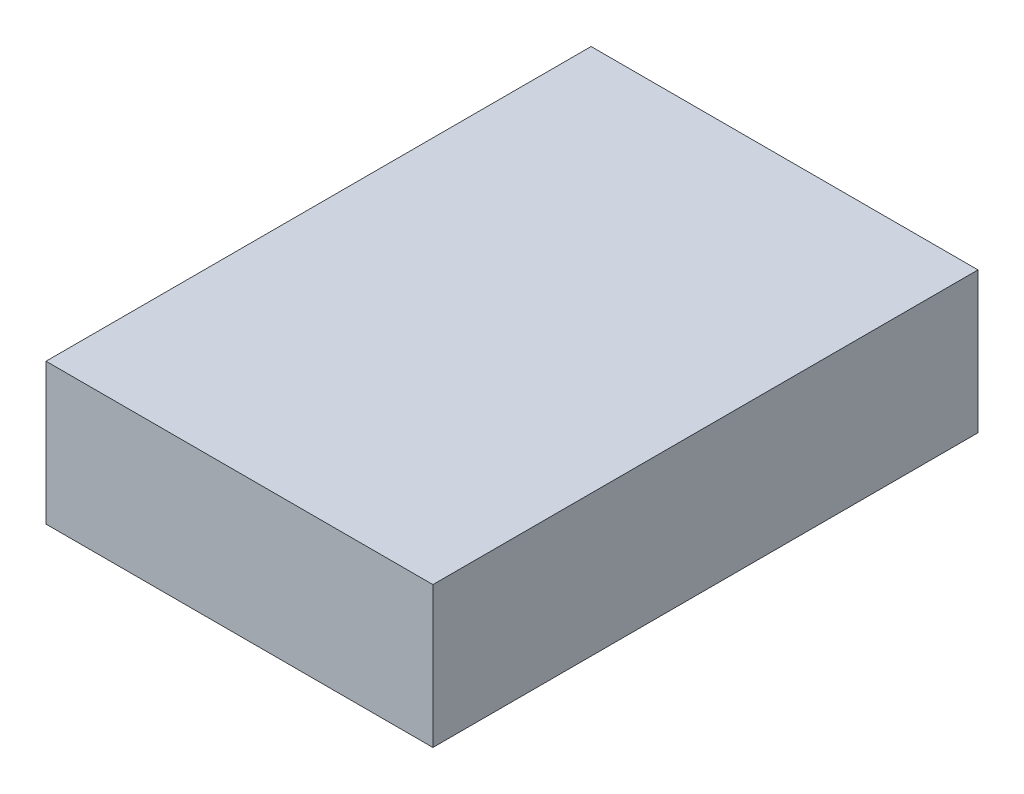
ISO-10303-21;
HEADER;
FILE_DESCRIPTION(('STEP AP214'),'2;1');
FILE_NAME('part.step','',(''),(''),'','','');
FILE_SCHEMA(('AUTOMOTIVE_DESIGN { 1 0 10303 214 1 1 1 1 }'));
ENDSEC;
DATA;
#1=APPLICATION_CONTEXT('core data for automotive mechanical design processes');
#2=APPLICATION_PROTOCOL_DEFINITION('international standard','automotive_design',2000,#1);
#3=PRODUCT_CONTEXT('',#1,'mechanical');
#4=PRODUCT('Part','Part','',(#3));
#5=PRODUCT_RELATED_PRODUCT_CATEGORY('part','',(#4));
#6=PRODUCT_DEFINITION_FORMATION('','',#4);
#7=PRODUCT_DEFINITION_CONTEXT('part definition',#1,'design');
#8=PRODUCT_DEFINITION('design','',#6,#7);
#9=PRODUCT_DEFINITION_SHAPE('','',#8);
#10=(LENGTH_UNIT() NAMED_UNIT(*) SI_UNIT(.MILLI.,.METRE.));
#11=(NAMED_UNIT(*) PLANE_ANGLE_UNIT() SI_UNIT($,.RADIAN.));
#12=(NAMED_UNIT(*) SI_UNIT($,.STERADIAN.) SOLID_ANGLE_UNIT());
#13=UNCERTAINTY_MEASURE_WITH_UNIT(LENGTH_MEASURE(1.E-05),#10,'distance_accuracy_value','');
#14=(GEOMETRIC_REPRESENTATION_CONTEXT(3) GLOBAL_UNCERTAINTY_ASSIGNED_CONTEXT((#13)) GLOBAL_UNIT_ASSIGNED_CONTEXT((#10,
#11,#12)) REPRESENTATION_CONTEXT('',''));
#15=CARTESIAN_POINT('',(0.,0.,0.));
#16=DIRECTION('',(0.,0.,1.));
#17=DIRECTION('',(1.,0.,0.));
#18=AXIS2_PLACEMENT_3D('',#15,#16,#17);
#19=CARTESIAN_POINT('',(0.,0.,64.77));
#20=DIRECTION('',(-1.,0.,0.));
#21=DIRECTION('',(0.,0.,1.));
#22=AXIS2_PLACEMENT_3D('',#19,#20,#21);
#23=PLANE('',#22);
#24=DIRECTION('',(0.,1.,0.));
#25=VECTOR('',#24,1.);
#26=CARTESIAN_POINT('',(0.,0.,0.));
#27=LINE('',#26,#25);
#28=CARTESIAN_POINT('',(0.,0.,0.));
#29=VERTEX_POINT('',#28);
#30=CARTESIAN_POINT('',(0.,16.764,0.));
#31=VERTEX_POINT('',#30);
#32=EDGE_CURVE('E99',#29,#31,#27,.T.);
#33=ORIENTED_EDGE('',*,*,#32,.F.);
#34=DIRECTION('',(0.,0.,-1.));
#35=VECTOR('',#34,1.);
#36=CARTESIAN_POINT('',(0.,0.,64.77));
#37=LINE('',#36,#35);
#38=CARTESIAN_POINT('',(0.,0.,64.77));
#39=VERTEX_POINT('',#38);
#40=EDGE_CURVE('E11',#39,#29,#37,.T.);
#41=ORIENTED_EDGE('',*,*,#40,.F.);
#42=DIRECTION('',(0.,1.,0.));
#43=VECTOR('',#42,1.);
#44=CARTESIAN_POINT('',(0.,0.,64.77));
#45=LINE('',#44,#43);
#46=CARTESIAN_POINT('',(0.,16.764,64.77));
#47=VERTEX_POINT('',#46);
#48=EDGE_CURVE('E94',#39,#47,#45,.T.);
#49=ORIENTED_EDGE('',*,*,#48,.T.);
#50=DIRECTION('',(0.,0.,-1.));
#51=VECTOR('',#50,1.);
#52=CARTESIAN_POINT('',(0.,16.764,64.77));
#53=LINE('',#52,#51);
#54=EDGE_CURVE('E37',#47,#31,#53,.T.);
#55=ORIENTED_EDGE('',*,*,#54,.T.);
#56=EDGE_LOOP('',(#33,#41,#49,#55));
#57=FACE_BOUND('',#56,.T.);
#58=ADVANCED_FACE('F34',(#57),#23,.T.);
#59=CARTESIAN_POINT('',(0.,0.,64.77));
#60=DIRECTION('',(0.,1.,0.));
#61=DIRECTION('',(0.,0.,1.));
#62=AXIS2_PLACEMENT_3D('',#59,#60,#61);
#63=PLANE('',#62);
#64=DIRECTION('',(1.,0.,0.));
#65=VECTOR('',#64,1.);
#66=CARTESIAN_POINT('',(0.,0.,0.));
#67=LINE('',#66,#65);
#68=CARTESIAN_POINT('',(45.974,0.,0.));
#69=VERTEX_POINT('',#68);
#70=EDGE_CURVE('E67',#29,#69,#67,.T.);
#71=ORIENTED_EDGE('',*,*,#70,.T.);
#72=DIRECTION('',(0.,0.,-1.));
#73=VECTOR('',#72,1.);
#74=CARTESIAN_POINT('',(45.974,0.,64.77));
#75=LINE('',#74,#73);
#76=CARTESIAN_POINT('',(45.974,0.,64.77));
#77=VERTEX_POINT('',#76);
#78=EDGE_CURVE('E43',#77,#69,#75,.T.);
#79=ORIENTED_EDGE('',*,*,#78,.F.);
#80=DIRECTION('',(1.,0.,0.));
#81=VECTOR('',#80,1.);
#82=CARTESIAN_POINT('',(0.,0.,64.77));
#83=LINE('',#82,#81);
#84=EDGE_CURVE('E84',#39,#77,#83,.T.);
#85=ORIENTED_EDGE('',*,*,#84,.F.);
#86=ORIENTED_EDGE('',*,*,#40,.T.);
#87=EDGE_LOOP('',(#71,#79,#85,#86));
#88=FACE_BOUND('',#87,.T.);
#89=ADVANCED_FACE('F109',(#88),#63,.F.);
#90=CARTESIAN_POINT('',(45.974,0.,64.77));
#91=DIRECTION('',(-1.,0.,0.));
#92=DIRECTION('',(0.,0.,1.));
#93=AXIS2_PLACEMENT_3D('',#90,#91,#92);
#94=PLANE('',#93);
#95=DIRECTION('',(0.,1.,0.));
#96=VECTOR('',#95,1.);
#97=CARTESIAN_POINT('',(45.974,0.,0.));
#98=LINE('',#97,#96);
#99=CARTESIAN_POINT('',(45.974,16.764,0.));
#100=VERTEX_POINT('',#99);
#101=EDGE_CURVE('E91',#69,#100,#98,.T.);
#102=ORIENTED_EDGE('',*,*,#101,.T.);
#103=DIRECTION('',(0.,0.,-1.));
#104=VECTOR('',#103,1.);
#105=CARTESIAN_POINT('',(45.974,16.764,64.77));
#106=LINE('',#105,#104);
#107=CARTESIAN_POINT('',(45.974,16.764,64.77));
#108=VERTEX_POINT('',#107);
#109=EDGE_CURVE('E88',#108,#100,#106,.T.);
#110=ORIENTED_EDGE('',*,*,#109,.F.);
#111=DIRECTION('',(0.,1.,0.));
#112=VECTOR('',#111,1.);
#113=CARTESIAN_POINT('',(45.974,0.,64.77));
#114=LINE('',#113,#112);
#115=EDGE_CURVE('E79',#77,#108,#114,.T.);
#116=ORIENTED_EDGE('',*,*,#115,.F.);
#117=ORIENTED_EDGE('',*,*,#78,.T.);
#118=EDGE_LOOP('',(#102,#110,#116,#117));
#119=FACE_BOUND('',#118,.T.);
#120=ADVANCED_FACE('F89',(#119),#94,.F.);
#121=CARTESIAN_POINT('',(0.,16.764,64.77));
#122=DIRECTION('',(0.,1.,0.));
#123=DIRECTION('',(0.,0.,1.));
#124=AXIS2_PLACEMENT_3D('',#121,#122,#123);
#125=PLANE('',#124);
#126=DIRECTION('',(1.,0.,0.));
#127=VECTOR('',#126,1.);
#128=CARTESIAN_POINT('',(0.,16.764,0.));
#129=LINE('',#128,#127);
#130=EDGE_CURVE('E102',#31,#100,#129,.T.);
#131=ORIENTED_EDGE('',*,*,#130,.F.);
#132=ORIENTED_EDGE('',*,*,#54,.F.);
#133=DIRECTION('',(1.,0.,0.));
#134=VECTOR('',#133,1.);
#135=CARTESIAN_POINT('',(0.,16.764,64.77));
#136=LINE('',#135,#134);
#137=EDGE_CURVE('E83',#47,#108,#136,.T.);
#138=ORIENTED_EDGE('',*,*,#137,.T.);
#139=ORIENTED_EDGE('',*,*,#109,.T.);
#140=EDGE_LOOP('',(#131,#132,#138,#139));
#141=FACE_BOUND('',#140,.T.);
#142=ADVANCED_FACE('F93',(#141),#125,.T.);
#143=CARTESIAN_POINT('',(0.,0.,64.77));
#144=DIRECTION('',(0.,0.,-1.));
#145=DIRECTION('',(-1.,0.,0.));
#146=AXIS2_PLACEMENT_3D('',#143,#144,#145);
#147=PLANE('',#146);
#148=ORIENTED_EDGE('',*,*,#48,.F.);
#149=ORIENTED_EDGE('',*,*,#84,.T.);
#150=ORIENTED_EDGE('',*,*,#115,.T.);
#151=ORIENTED_EDGE('',*,*,#137,.F.);
#152=EDGE_LOOP('',(#148,#149,#150,#151));
#153=FACE_BOUND('',#152,.T.);
#154=ADVANCED_FACE('F82',(#153),#147,.F.);
#155=CARTESIAN_POINT('',(0.,0.,0.));
#156=DIRECTION('',(0.,0.,-1.));
#157=DIRECTION('',(-1.,0.,0.));
#158=AXIS2_PLACEMENT_3D('',#155,#156,#157);
#159=PLANE('',#158);
#160=ORIENTED_EDGE('',*,*,#32,.T.);
#161=ORIENTED_EDGE('',*,*,#130,.T.);
#162=ORIENTED_EDGE('',*,*,#101,.F.);
#163=ORIENTED_EDGE('',*,*,#70,.F.);
#164=EDGE_LOOP('',(#160,#161,#162,#163));
#165=FACE_BOUND('',#164,.T.);
#166=ADVANCED_FACE('F107',(#165),#159,.T.);
#167=CLOSED_SHELL('',(#58,#89,#120,#142,#154,#166));
#168=MANIFOLD_SOLID_BREP('B2',#167);
#169=ADVANCED_BREP_SHAPE_REPRESENTATION('',(#18,#168),#14);
#170=SHAPE_DEFINITION_REPRESENTATION(#9,#169);
ENDSEC;
END-ISO-10303-21;
